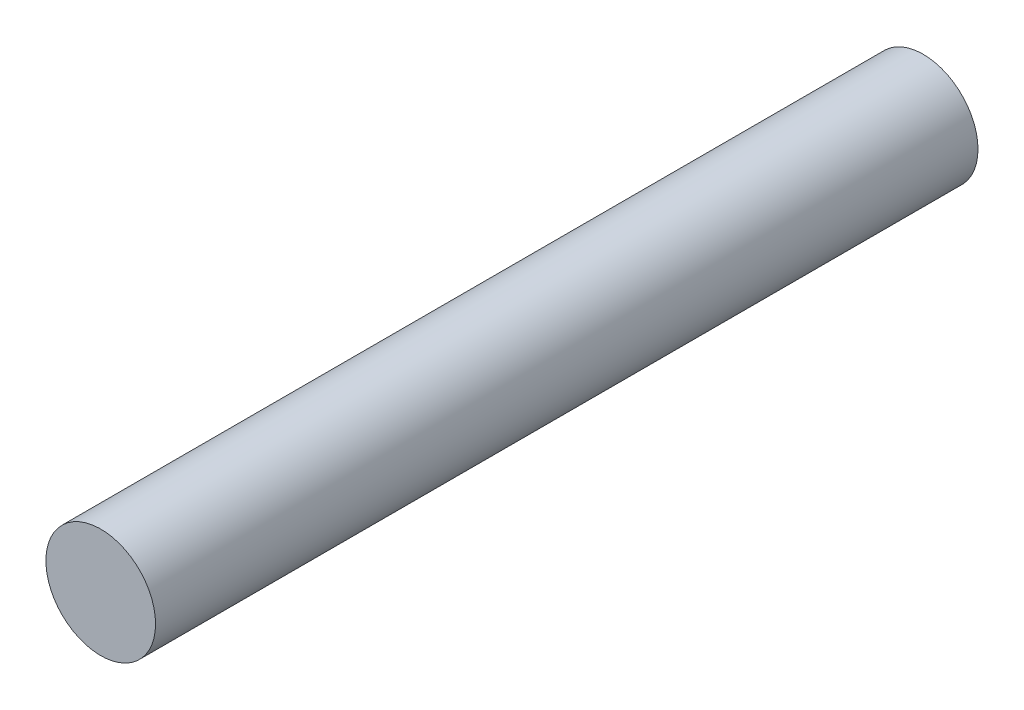
ISO-10303-21;
HEADER;
FILE_DESCRIPTION(('STEP AP214'),'2;1');
FILE_NAME('part.step','',(''),(''),'','','');
FILE_SCHEMA(('AUTOMOTIVE_DESIGN { 1 0 10303 214 1 1 1 1 }'));
ENDSEC;
DATA;
#1=APPLICATION_CONTEXT('core data for automotive mechanical design processes');
#2=APPLICATION_PROTOCOL_DEFINITION('international standard','automotive_design',2000,#1);
#3=PRODUCT_CONTEXT('',#1,'mechanical');
#4=PRODUCT('Part','Part','',(#3));
#5=PRODUCT_RELATED_PRODUCT_CATEGORY('part','',(#4));
#6=PRODUCT_DEFINITION_FORMATION('','',#4);
#7=PRODUCT_DEFINITION_CONTEXT('part definition',#1,'design');
#8=PRODUCT_DEFINITION('design','',#6,#7);
#9=PRODUCT_DEFINITION_SHAPE('','',#8);
#10=(LENGTH_UNIT() NAMED_UNIT(*) SI_UNIT(.MILLI.,.METRE.));
#11=(NAMED_UNIT(*) PLANE_ANGLE_UNIT() SI_UNIT($,.RADIAN.));
#12=(NAMED_UNIT(*) SI_UNIT($,.STERADIAN.) SOLID_ANGLE_UNIT());
#13=UNCERTAINTY_MEASURE_WITH_UNIT(LENGTH_MEASURE(1.E-05),#10,'distance_accuracy_value','');
#14=(GEOMETRIC_REPRESENTATION_CONTEXT(3) GLOBAL_UNCERTAINTY_ASSIGNED_CONTEXT((#13)) GLOBAL_UNIT_ASSIGNED_CONTEXT((#10,
#11,#12)) REPRESENTATION_CONTEXT('',''));
#15=CARTESIAN_POINT('',(0.,0.,0.));
#16=DIRECTION('',(0.,0.,1.));
#17=DIRECTION('',(1.,0.,0.));
#18=AXIS2_PLACEMENT_3D('',#15,#16,#17);
#19=CARTESIAN_POINT('',(0.,0.,150.));
#20=DIRECTION('',(0.,0.,-1.));
#21=DIRECTION('',(-1.,0.,0.));
#22=AXIS2_PLACEMENT_3D('',#19,#20,#21);
#23=CYLINDRICAL_SURFACE('',#22,10.);
#24=CARTESIAN_POINT('',(0.,0.,150.));
#25=DIRECTION('',(0.,0.,1.));
#26=DIRECTION('',(1.,0.,0.));
#27=AXIS2_PLACEMENT_3D('',#24,#25,#26);
#28=CIRCLE('',#27,10.);
#29=CARTESIAN_POINT('',(10.,0.,150.));
#30=VERTEX_POINT('',#29);
#31=EDGE_CURVE('E10',#30,#30,#28,.T.);
#32=ORIENTED_EDGE('',*,*,#31,.F.);
#33=EDGE_LOOP('',(#32));
#34=FACE_BOUND('',#33,.T.);
#35=CARTESIAN_POINT('',(0.,0.,0.));
#36=DIRECTION('',(0.,0.,1.));
#37=DIRECTION('',(1.,0.,0.));
#38=AXIS2_PLACEMENT_3D('',#35,#36,#37);
#39=CIRCLE('',#38,10.);
#40=CARTESIAN_POINT('',(10.,0.,0.));
#41=VERTEX_POINT('',#40);
#42=EDGE_CURVE('E44',#41,#41,#39,.T.);
#43=ORIENTED_EDGE('',*,*,#42,.T.);
#44=EDGE_LOOP('',(#43));
#45=FACE_BOUND('',#44,.T.);
#46=ADVANCED_FACE('F41',(#34,#45),#23,.T.);
#47=CARTESIAN_POINT('',(0.,0.,150.));
#48=DIRECTION('',(0.,0.,1.));
#49=DIRECTION('',(1.,0.,0.));
#50=AXIS2_PLACEMENT_3D('',#47,#48,#49);
#51=PLANE('',#50);
#52=ORIENTED_EDGE('',*,*,#31,.T.);
#53=EDGE_LOOP('',(#52));
#54=FACE_BOUND('',#53,.T.);
#55=ADVANCED_FACE('F58',(#54),#51,.T.);
#56=CARTESIAN_POINT('',(0.,0.,0.));
#57=DIRECTION('',(0.,0.,1.));
#58=DIRECTION('',(1.,0.,0.));
#59=AXIS2_PLACEMENT_3D('',#56,#57,#58);
#60=PLANE('',#59);
#61=ORIENTED_EDGE('',*,*,#42,.F.);
#62=EDGE_LOOP('',(#61));
#63=FACE_BOUND('',#62,.T.);
#64=ADVANCED_FACE('F56',(#63),#60,.F.);
#65=CLOSED_SHELL('',(#46,#55,#64));
#66=MANIFOLD_SOLID_BREP('B2',#65);
#67=ADVANCED_BREP_SHAPE_REPRESENTATION('',(#18,#66),#14);
#68=SHAPE_DEFINITION_REPRESENTATION(#9,#67);
ENDSEC;
END-ISO-10303-21;
